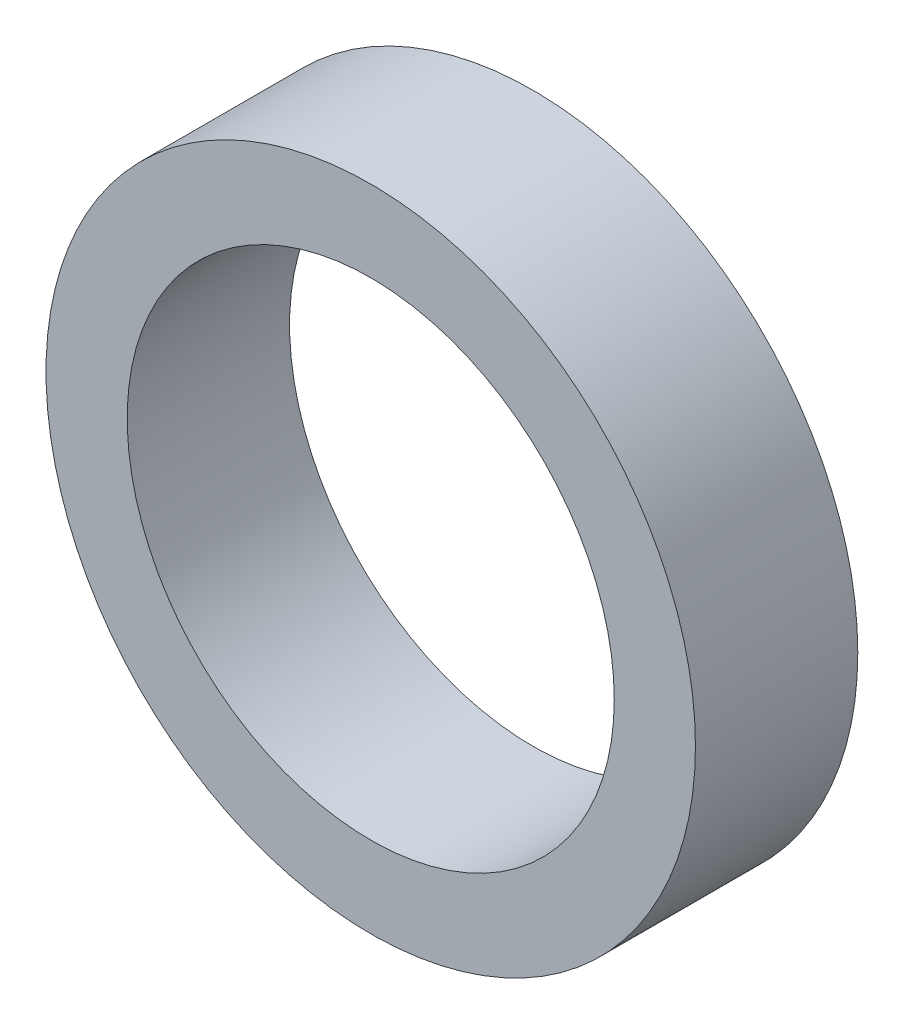
ISO-10303-21;
HEADER;
FILE_DESCRIPTION(('STEP AP214'),'2;1');
FILE_NAME('part.step','',(''),(''),'','','');
FILE_SCHEMA(('AUTOMOTIVE_DESIGN { 1 0 10303 214 1 1 1 1 }'));
ENDSEC;
DATA;
#1=APPLICATION_CONTEXT('core data for automotive mechanical design processes');
#2=APPLICATION_PROTOCOL_DEFINITION('international standard','automotive_design',2000,#1);
#3=PRODUCT_CONTEXT('',#1,'mechanical');
#4=PRODUCT('Part','Part','',(#3));
#5=PRODUCT_RELATED_PRODUCT_CATEGORY('part','',(#4));
#6=PRODUCT_DEFINITION_FORMATION('','',#4);
#7=PRODUCT_DEFINITION_CONTEXT('part definition',#1,'design');
#8=PRODUCT_DEFINITION('design','',#6,#7);
#9=PRODUCT_DEFINITION_SHAPE('','',#8);
#10=(LENGTH_UNIT() NAMED_UNIT(*) SI_UNIT(.MILLI.,.METRE.));
#11=(NAMED_UNIT(*) PLANE_ANGLE_UNIT() SI_UNIT($,.RADIAN.));
#12=(NAMED_UNIT(*) SI_UNIT($,.STERADIAN.) SOLID_ANGLE_UNIT());
#13=UNCERTAINTY_MEASURE_WITH_UNIT(LENGTH_MEASURE(1.E-05),#10,'distance_accuracy_value','');
#14=(GEOMETRIC_REPRESENTATION_CONTEXT(3) GLOBAL_UNCERTAINTY_ASSIGNED_CONTEXT((#13)) GLOBAL_UNIT_ASSIGNED_CONTEXT((#10,
#11,#12)) REPRESENTATION_CONTEXT('',''));
#15=CARTESIAN_POINT('',(0.,0.,0.));
#16=DIRECTION('',(0.,0.,1.));
#17=DIRECTION('',(1.,0.,0.));
#18=AXIS2_PLACEMENT_3D('',#15,#16,#17);
#19=CARTESIAN_POINT('',(0.,0.,2.));
#20=DIRECTION('',(0.,0.,1.));
#21=DIRECTION('',(1.,0.,0.));
#22=AXIS2_PLACEMENT_3D('',#19,#20,#21);
#23=PLANE('',#22);
#24=CARTESIAN_POINT('',(0.,0.,2.));
#25=DIRECTION('',(0.,0.,1.));
#26=DIRECTION('',(1.,0.,0.));
#27=AXIS2_PLACEMENT_3D('',#24,#25,#26);
#28=CIRCLE('',#27,4.);
#29=CARTESIAN_POINT('',(4.,0.,2.));
#30=VERTEX_POINT('',#29);
#31=EDGE_CURVE('E10',#30,#30,#28,.T.);
#32=ORIENTED_EDGE('',*,*,#31,.T.);
#33=EDGE_LOOP('',(#32));
#34=FACE_BOUND('',#33,.T.);
#35=CARTESIAN_POINT('',(0.,0.,2.));
#36=DIRECTION('',(0.,0.,1.));
#37=DIRECTION('',(1.,0.,0.));
#38=AXIS2_PLACEMENT_3D('',#35,#36,#37);
#39=CIRCLE('',#38,3.);
#40=CARTESIAN_POINT('',(3.,0.,2.));
#41=VERTEX_POINT('',#40);
#42=EDGE_CURVE('E50',#41,#41,#39,.T.);
#43=ORIENTED_EDGE('',*,*,#42,.F.);
#44=EDGE_LOOP('',(#43));
#45=FACE_BOUND('',#44,.T.);
#46=ADVANCED_FACE('F39',(#34,#45),#23,.T.);
#47=CARTESIAN_POINT('',(0.,0.,0.));
#48=DIRECTION('',(0.,0.,1.));
#49=DIRECTION('',(1.,0.,0.));
#50=AXIS2_PLACEMENT_3D('',#47,#48,#49);
#51=PLANE('',#50);
#52=CARTESIAN_POINT('',(0.,0.,0.));
#53=DIRECTION('',(0.,0.,1.));
#54=DIRECTION('',(1.,0.,0.));
#55=AXIS2_PLACEMENT_3D('',#52,#53,#54);
#56=CIRCLE('',#55,4.);
#57=CARTESIAN_POINT('',(4.,0.,0.));
#58=VERTEX_POINT('',#57);
#59=EDGE_CURVE('E43',#58,#58,#56,.T.);
#60=ORIENTED_EDGE('',*,*,#59,.F.);
#61=EDGE_LOOP('',(#60));
#62=FACE_BOUND('',#61,.T.);
#63=CARTESIAN_POINT('',(0.,0.,0.));
#64=DIRECTION('',(0.,0.,1.));
#65=DIRECTION('',(1.,0.,0.));
#66=AXIS2_PLACEMENT_3D('',#63,#64,#65);
#67=CIRCLE('',#66,3.);
#68=CARTESIAN_POINT('',(3.,0.,0.));
#69=VERTEX_POINT('',#68);
#70=EDGE_CURVE('E52',#69,#69,#67,.T.);
#71=ORIENTED_EDGE('',*,*,#70,.T.);
#72=EDGE_LOOP('',(#71));
#73=FACE_BOUND('',#72,.T.);
#74=ADVANCED_FACE('F62',(#62,#73),#51,.F.);
#75=CARTESIAN_POINT('',(0.,0.,2.));
#76=DIRECTION('',(0.,0.,-1.));
#77=DIRECTION('',(-1.,0.,0.));
#78=AXIS2_PLACEMENT_3D('',#75,#76,#77);
#79=CYLINDRICAL_SURFACE('',#78,4.);
#80=ORIENTED_EDGE('',*,*,#31,.F.);
#81=EDGE_LOOP('',(#80));
#82=FACE_BOUND('',#81,.T.);
#83=ORIENTED_EDGE('',*,*,#59,.T.);
#84=EDGE_LOOP('',(#83));
#85=FACE_BOUND('',#84,.T.);
#86=ADVANCED_FACE('F41',(#82,#85),#79,.T.);
#87=CARTESIAN_POINT('',(0.,0.,2.));
#88=DIRECTION('',(0.,0.,-1.));
#89=DIRECTION('',(-1.,0.,0.));
#90=AXIS2_PLACEMENT_3D('',#87,#88,#89);
#91=CYLINDRICAL_SURFACE('',#90,3.);
#92=ORIENTED_EDGE('',*,*,#42,.T.);
#93=EDGE_LOOP('',(#92));
#94=FACE_BOUND('',#93,.T.);
#95=ORIENTED_EDGE('',*,*,#70,.F.);
#96=EDGE_LOOP('',(#95));
#97=FACE_BOUND('',#96,.T.);
#98=ADVANCED_FACE('F58',(#94,#97),#91,.F.);
#99=CLOSED_SHELL('',(#46,#74,#86,#98));
#100=MANIFOLD_SOLID_BREP('B2',#99);
#101=ADVANCED_BREP_SHAPE_REPRESENTATION('',(#18,#100),#14);
#102=SHAPE_DEFINITION_REPRESENTATION(#9,#101);
ENDSEC;
END-ISO-10303-21;
